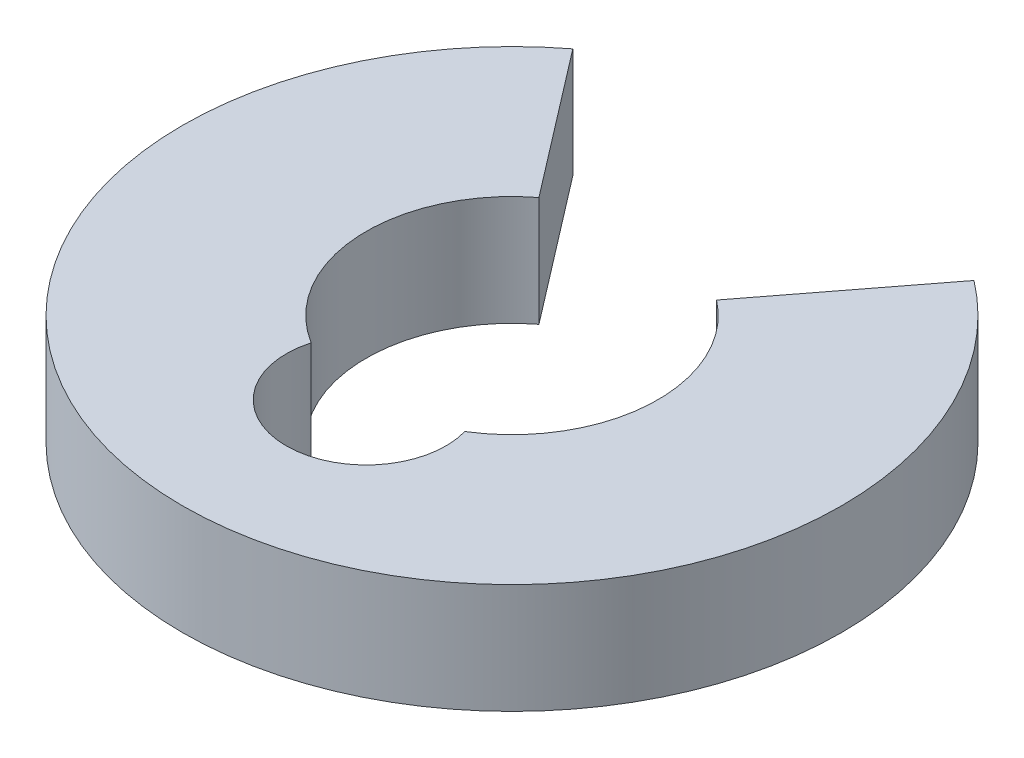
ISO-10303-21;
HEADER;
FILE_DESCRIPTION(('STEP AP214'),'2;1');
FILE_NAME('part.step','',(''),(''),'','','');
FILE_SCHEMA(('AUTOMOTIVE_DESIGN { 1 0 10303 214 1 1 1 1 }'));
ENDSEC;
DATA;
#1=APPLICATION_CONTEXT('core data for automotive mechanical design processes');
#2=APPLICATION_PROTOCOL_DEFINITION('international standard','automotive_design',2000,#1);
#3=PRODUCT_CONTEXT('',#1,'mechanical');
#4=PRODUCT('Part','Part','',(#3));
#5=PRODUCT_RELATED_PRODUCT_CATEGORY('part','',(#4));
#6=PRODUCT_DEFINITION_FORMATION('','',#4);
#7=PRODUCT_DEFINITION_CONTEXT('part definition',#1,'design');
#8=PRODUCT_DEFINITION('design','',#6,#7);
#9=PRODUCT_DEFINITION_SHAPE('','',#8);
#10=(LENGTH_UNIT() NAMED_UNIT(*) SI_UNIT(.MILLI.,.METRE.));
#11=(NAMED_UNIT(*) PLANE_ANGLE_UNIT() SI_UNIT($,.RADIAN.));
#12=(NAMED_UNIT(*) SI_UNIT($,.STERADIAN.) SOLID_ANGLE_UNIT());
#13=UNCERTAINTY_MEASURE_WITH_UNIT(LENGTH_MEASURE(1.E-05),#10,'distance_accuracy_value','');
#14=(GEOMETRIC_REPRESENTATION_CONTEXT(3) GLOBAL_UNCERTAINTY_ASSIGNED_CONTEXT((#13)) GLOBAL_UNIT_ASSIGNED_CONTEXT((#10,
#11,#12)) REPRESENTATION_CONTEXT('',''));
#15=CARTESIAN_POINT('',(0.,0.,0.));
#16=DIRECTION('',(0.,0.,1.));
#17=DIRECTION('',(1.,0.,0.));
#18=AXIS2_PLACEMENT_3D('',#15,#16,#17);
#19=CARTESIAN_POINT('',(0.,0.79375,2.1082));
#20=DIRECTION('',(0.,-1.,0.));
#21=DIRECTION('',(0.,0.,-1.));
#22=AXIS2_PLACEMENT_3D('',#19,#20,#21);
#23=CYLINDRICAL_SURFACE('',#22,1.1543);
#24=DIRECTION('',(0.,1.,0.));
#25=VECTOR('',#24,1.);
#26=CARTESIAN_POINT('',(-1.11020204436313,0.,1.7921938122569));
#27=LINE('',#26,#25);
#28=CARTESIAN_POINT('',(-1.11020204436313,-0.79375,1.7921938122569));
#29=VERTEX_POINT('',#28);
#30=CARTESIAN_POINT('',(-1.11020204436313,0.79375,1.7921938122569));
#31=VERTEX_POINT('',#30);
#32=EDGE_CURVE('E119',#29,#31,#27,.T.);
#33=ORIENTED_EDGE('',*,*,#32,.T.);
#34=CARTESIAN_POINT('',(0.,0.79375,2.1082));
#35=DIRECTION('',(0.,-1.,0.));
#36=DIRECTION('',(0.,0.,-1.));
#37=AXIS2_PLACEMENT_3D('',#34,#35,#36);
#38=CIRCLE('',#37,1.1543);
#39=CARTESIAN_POINT('',(1.11020204436313,0.79375,1.7921938122569));
#40=VERTEX_POINT('',#39);
#41=EDGE_CURVE('E80',#40,#31,#38,.T.);
#42=ORIENTED_EDGE('',*,*,#41,.F.);
#43=DIRECTION('',(0.,-1.,0.));
#44=VECTOR('',#43,1.);
#45=CARTESIAN_POINT('',(1.11020204436313,0.,1.7921938122569));
#46=LINE('',#45,#44);
#47=CARTESIAN_POINT('',(1.11020204436313,-0.79375,1.7921938122569));
#48=VERTEX_POINT('',#47);
#49=EDGE_CURVE('E28',#40,#48,#46,.T.);
#50=ORIENTED_EDGE('',*,*,#49,.T.);
#51=CARTESIAN_POINT('',(0.,-0.79375,2.1082));
#52=DIRECTION('',(0.,-1.,0.));
#53=DIRECTION('',(0.,0.,-1.));
#54=AXIS2_PLACEMENT_3D('',#51,#52,#53);
#55=CIRCLE('',#54,1.1543);
#56=EDGE_CURVE('E67',#48,#29,#55,.T.);
#57=ORIENTED_EDGE('',*,*,#56,.T.);
#58=EDGE_LOOP('',(#33,#42,#50,#57));
#59=FACE_BOUND('',#58,.T.);
#60=ADVANCED_FACE('F17',(#59),#23,.F.);
#61=CARTESIAN_POINT('',(0.,0.79375,0.));
#62=DIRECTION('',(-0.793353340291235,0.,0.608761429008721));
#63=DIRECTION('',(0.,1.,0.));
#64=AXIS2_PLACEMENT_3D('',#61,#62,#63);
#65=PLANE('',#64);
#66=DIRECTION('',(0.,-1.,0.));
#67=VECTOR('',#66,1.);
#68=CARTESIAN_POINT('',(-1.28339084463619,0.79375,-1.67254751200198));
#69=LINE('',#68,#67);
#70=CARTESIAN_POINT('',(-1.28339084463619,0.79375,-1.67254751200198));
#71=VERTEX_POINT('',#70);
#72=CARTESIAN_POINT('',(-1.28339084463619,-0.79375,-1.67254751200198));
#73=VERTEX_POINT('',#72);
#74=EDGE_CURVE('E133',#71,#73,#69,.T.);
#75=ORIENTED_EDGE('',*,*,#74,.T.);
#76=DIRECTION('',(-0.608761429008721,0.,-0.793353340291235));
#77=VECTOR('',#76,1.);
#78=CARTESIAN_POINT('',(0.,-0.79375,0.));
#79=LINE('',#78,#77);
#80=CARTESIAN_POINT('',(-2.89922630565404,-0.79375,-3.778345283137));
#81=VERTEX_POINT('',#80);
#82=EDGE_CURVE('E145',#73,#81,#79,.T.);
#83=ORIENTED_EDGE('',*,*,#82,.T.);
#84=DIRECTION('',(0.,-1.,0.));
#85=VECTOR('',#84,1.);
#86=CARTESIAN_POINT('',(-2.89922630565404,0.79375,-3.778345283137));
#87=LINE('',#86,#85);
#88=CARTESIAN_POINT('',(-2.89922630565404,0.79375,-3.778345283137));
#89=VERTEX_POINT('',#88);
#90=EDGE_CURVE('E43',#89,#81,#87,.T.);
#91=ORIENTED_EDGE('',*,*,#90,.F.);
#92=DIRECTION('',(-0.608761429008721,0.,-0.793353340291235));
#93=VECTOR('',#92,1.);
#94=CARTESIAN_POINT('',(0.,0.79375,0.));
#95=LINE('',#94,#93);
#96=EDGE_CURVE('E121',#71,#89,#95,.T.);
#97=ORIENTED_EDGE('',*,*,#96,.F.);
#98=EDGE_LOOP('',(#75,#83,#91,#97));
#99=FACE_BOUND('',#98,.T.);
#100=ADVANCED_FACE('F159',(#99),#65,.F.);
#101=CARTESIAN_POINT('',(0.,0.79375,0.));
#102=DIRECTION('',(-0.793353340291234,0.,-0.608761429008723));
#103=DIRECTION('',(-0.608761429008723,0.,0.793353340291234));
#104=AXIS2_PLACEMENT_3D('',#101,#102,#103);
#105=PLANE('',#104);
#106=DIRECTION('',(0.608761429008722,0.,-0.793353340291234));
#107=VECTOR('',#106,1.);
#108=CARTESIAN_POINT('',(0.,0.79375,0.));
#109=LINE('',#108,#107);
#110=CARTESIAN_POINT('',(1.28339084463619,0.79375,-1.67254751200198));
#111=VERTEX_POINT('',#110);
#112=CARTESIAN_POINT('',(2.89922630565404,0.79375,-3.778345283137));
#113=VERTEX_POINT('',#112);
#114=EDGE_CURVE('E115',#111,#113,#109,.T.);
#115=ORIENTED_EDGE('',*,*,#114,.T.);
#116=DIRECTION('',(0.,-1.,0.));
#117=VECTOR('',#116,1.);
#118=CARTESIAN_POINT('',(2.89922630565404,0.79375,-3.778345283137));
#119=LINE('',#118,#117);
#120=CARTESIAN_POINT('',(2.89922630565404,-0.79375,-3.778345283137));
#121=VERTEX_POINT('',#120);
#122=EDGE_CURVE('E111',#113,#121,#119,.T.);
#123=ORIENTED_EDGE('',*,*,#122,.T.);
#124=DIRECTION('',(0.608761429008722,0.,-0.793353340291234));
#125=VECTOR('',#124,1.);
#126=CARTESIAN_POINT('',(0.,-0.79375,0.));
#127=LINE('',#126,#125);
#128=CARTESIAN_POINT('',(1.28339084463619,-0.79375,-1.67254751200198));
#129=VERTEX_POINT('',#128);
#130=EDGE_CURVE('E140',#129,#121,#127,.T.);
#131=ORIENTED_EDGE('',*,*,#130,.F.);
#132=DIRECTION('',(0.,-1.,0.));
#133=VECTOR('',#132,1.);
#134=CARTESIAN_POINT('',(1.28339084463619,0.79375,-1.67254751200198));
#135=LINE('',#134,#133);
#136=EDGE_CURVE('E11',#111,#129,#135,.T.);
#137=ORIENTED_EDGE('',*,*,#136,.F.);
#138=EDGE_LOOP('',(#115,#123,#131,#137));
#139=FACE_BOUND('',#138,.T.);
#140=ADVANCED_FACE('F168',(#139),#105,.T.);
#141=CARTESIAN_POINT('',(0.,0.79375,0.));
#142=DIRECTION('',(0.,-1.,0.));
#143=DIRECTION('',(0.,0.,-1.));
#144=AXIS2_PLACEMENT_3D('',#141,#142,#143);
#145=CYLINDRICAL_SURFACE('',#144,2.1082);
#146=ORIENTED_EDGE('',*,*,#49,.F.);
#147=CARTESIAN_POINT('',(0.,0.79375,0.));
#148=DIRECTION('',(0.,1.,0.));
#149=DIRECTION('',(0.,0.,1.));
#150=AXIS2_PLACEMENT_3D('',#147,#148,#149);
#151=CIRCLE('',#150,2.1082);
#152=EDGE_CURVE('E106',#40,#111,#151,.T.);
#153=ORIENTED_EDGE('',*,*,#152,.T.);
#154=ORIENTED_EDGE('',*,*,#136,.T.);
#155=CARTESIAN_POINT('',(0.,-0.79375,0.));
#156=DIRECTION('',(0.,1.,0.));
#157=DIRECTION('',(0.,0.,1.));
#158=AXIS2_PLACEMENT_3D('',#155,#156,#157);
#159=CIRCLE('',#158,2.1082);
#160=EDGE_CURVE('E109',#48,#129,#159,.T.);
#161=ORIENTED_EDGE('',*,*,#160,.F.);
#162=EDGE_LOOP('',(#146,#153,#154,#161));
#163=FACE_BOUND('',#162,.T.);
#164=ADVANCED_FACE('F105',(#163),#145,.F.);
#165=CARTESIAN_POINT('',(0.,0.79375,0.));
#166=DIRECTION('',(0.,-1.,0.));
#167=DIRECTION('',(0.,0.,-1.));
#168=AXIS2_PLACEMENT_3D('',#165,#166,#167);
#169=CYLINDRICAL_SURFACE('',#168,4.7625);
#170=CARTESIAN_POINT('',(0.,0.79375,0.));
#171=DIRECTION('',(0.,1.,0.));
#172=DIRECTION('',(0.,0.,1.));
#173=AXIS2_PLACEMENT_3D('',#170,#171,#172);
#174=CIRCLE('',#173,4.7625);
#175=EDGE_CURVE('E130',#89,#113,#174,.T.);
#176=ORIENTED_EDGE('',*,*,#175,.F.);
#177=ORIENTED_EDGE('',*,*,#90,.T.);
#178=CARTESIAN_POINT('',(0.,-0.79375,0.));
#179=DIRECTION('',(0.,1.,0.));
#180=DIRECTION('',(0.,0.,1.));
#181=AXIS2_PLACEMENT_3D('',#178,#179,#180);
#182=CIRCLE('',#181,4.7625);
#183=EDGE_CURVE('E143',#81,#121,#182,.T.);
#184=ORIENTED_EDGE('',*,*,#183,.T.);
#185=ORIENTED_EDGE('',*,*,#122,.F.);
#186=EDGE_LOOP('',(#176,#177,#184,#185));
#187=FACE_BOUND('',#186,.T.);
#188=ADVANCED_FACE('F165',(#187),#169,.T.);
#189=CARTESIAN_POINT('',(0.,-0.79375,0.));
#190=DIRECTION('',(0.,1.,0.));
#191=DIRECTION('',(1.,0.,0.));
#192=AXIS2_PLACEMENT_3D('',#189,#190,#191);
#193=PLANE('',#192);
#194=CARTESIAN_POINT('',(0.,-0.79375,0.));
#195=DIRECTION('',(0.,1.,0.));
#196=DIRECTION('',(0.,0.,1.));
#197=AXIS2_PLACEMENT_3D('',#194,#195,#196);
#198=CIRCLE('',#197,2.1082);
#199=EDGE_CURVE('E21',#73,#29,#198,.T.);
#200=ORIENTED_EDGE('',*,*,#199,.T.);
#201=ORIENTED_EDGE('',*,*,#56,.F.);
#202=ORIENTED_EDGE('',*,*,#160,.T.);
#203=ORIENTED_EDGE('',*,*,#130,.T.);
#204=ORIENTED_EDGE('',*,*,#183,.F.);
#205=ORIENTED_EDGE('',*,*,#82,.F.);
#206=EDGE_LOOP('',(#200,#201,#202,#203,#204,#205));
#207=FACE_BOUND('',#206,.T.);
#208=ADVANCED_FACE('F163',(#207),#193,.F.);
#209=CARTESIAN_POINT('',(0.,0.79375,0.));
#210=DIRECTION('',(0.,1.,0.));
#211=DIRECTION('',(1.,0.,0.));
#212=AXIS2_PLACEMENT_3D('',#209,#210,#211);
#213=PLANE('',#212);
#214=ORIENTED_EDGE('',*,*,#41,.T.);
#215=CARTESIAN_POINT('',(0.,0.79375,0.));
#216=DIRECTION('',(0.,1.,0.));
#217=DIRECTION('',(0.,0.,1.));
#218=AXIS2_PLACEMENT_3D('',#215,#216,#217);
#219=CIRCLE('',#218,2.1082);
#220=EDGE_CURVE('E122',#71,#31,#219,.T.);
#221=ORIENTED_EDGE('',*,*,#220,.F.);
#222=ORIENTED_EDGE('',*,*,#96,.T.);
#223=ORIENTED_EDGE('',*,*,#175,.T.);
#224=ORIENTED_EDGE('',*,*,#114,.F.);
#225=ORIENTED_EDGE('',*,*,#152,.F.);
#226=EDGE_LOOP('',(#214,#221,#222,#223,#224,#225));
#227=FACE_BOUND('',#226,.T.);
#228=ADVANCED_FACE('F19',(#227),#213,.T.);
#229=CARTESIAN_POINT('',(0.,0.79375,0.));
#230=DIRECTION('',(0.,-1.,0.));
#231=DIRECTION('',(0.,0.,-1.));
#232=AXIS2_PLACEMENT_3D('',#229,#230,#231);
#233=CYLINDRICAL_SURFACE('',#232,2.1082);
#234=ORIENTED_EDGE('',*,*,#32,.F.);
#235=ORIENTED_EDGE('',*,*,#199,.F.);
#236=ORIENTED_EDGE('',*,*,#74,.F.);
#237=ORIENTED_EDGE('',*,*,#220,.T.);
#238=EDGE_LOOP('',(#234,#235,#236,#237));
#239=FACE_BOUND('',#238,.T.);
#240=ADVANCED_FACE('F200',(#239),#233,.F.);
#241=CLOSED_SHELL('',(#60,#100,#140,#164,#188,#208,#228,#240));
#242=MANIFOLD_SOLID_BREP('B1',#241);
#243=ADVANCED_BREP_SHAPE_REPRESENTATION('',(#18,#242),#14);
#244=SHAPE_DEFINITION_REPRESENTATION(#9,#243);
ENDSEC;
END-ISO-10303-21;
